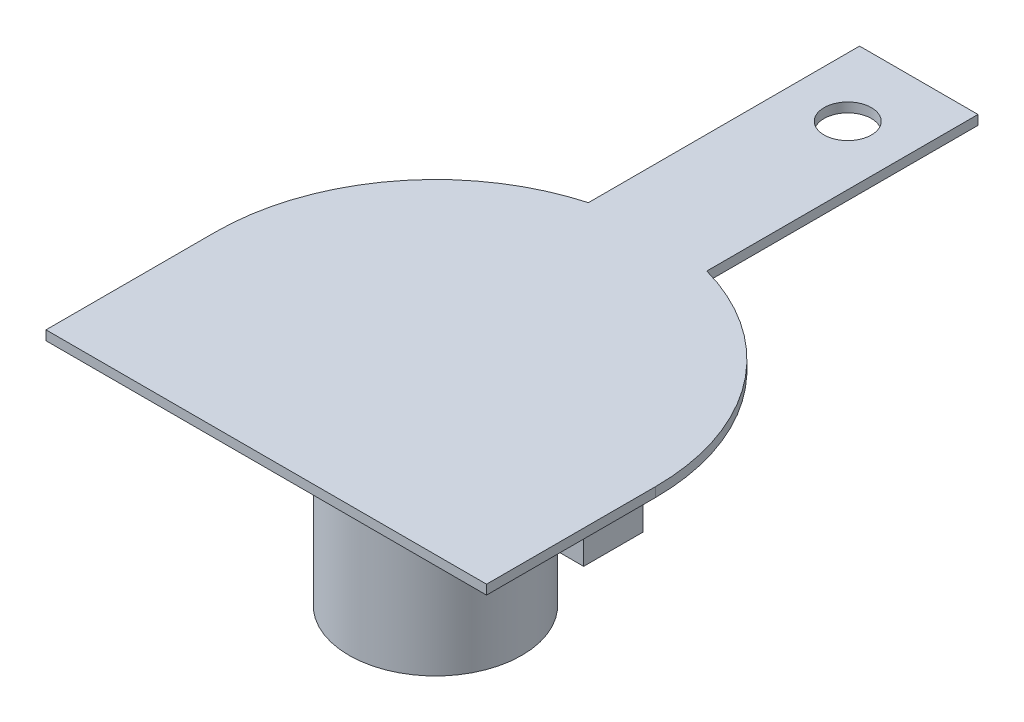
ISO-10303-21;
HEADER;
FILE_DESCRIPTION(('STEP AP214'),'2;1');
FILE_NAME('part.step','',(''),(''),'','','');
FILE_SCHEMA(('AUTOMOTIVE_DESIGN { 1 0 10303 214 1 1 1 1 }'));
ENDSEC;
DATA;
#1=APPLICATION_CONTEXT('core data for automotive mechanical design processes');
#2=APPLICATION_PROTOCOL_DEFINITION('international standard','automotive_design',2000,#1);
#3=PRODUCT_CONTEXT('',#1,'mechanical');
#4=PRODUCT('Part','Part','',(#3));
#5=PRODUCT_RELATED_PRODUCT_CATEGORY('part','',(#4));
#6=PRODUCT_DEFINITION_FORMATION('','',#4);
#7=PRODUCT_DEFINITION_CONTEXT('part definition',#1,'design');
#8=PRODUCT_DEFINITION('design','',#6,#7);
#9=PRODUCT_DEFINITION_SHAPE('','',#8);
#10=(LENGTH_UNIT() NAMED_UNIT(*) SI_UNIT(.MILLI.,.METRE.));
#11=(NAMED_UNIT(*) PLANE_ANGLE_UNIT() SI_UNIT($,.RADIAN.));
#12=(NAMED_UNIT(*) SI_UNIT($,.STERADIAN.) SOLID_ANGLE_UNIT());
#13=UNCERTAINTY_MEASURE_WITH_UNIT(LENGTH_MEASURE(1.E-05),#10,'distance_accuracy_value','');
#14=(GEOMETRIC_REPRESENTATION_CONTEXT(3) GLOBAL_UNCERTAINTY_ASSIGNED_CONTEXT((#13)) GLOBAL_UNIT_ASSIGNED_CONTEXT((#10,
#11,#12)) REPRESENTATION_CONTEXT('',''));
#15=CARTESIAN_POINT('',(0.,0.,0.));
#16=DIRECTION('',(0.,0.,1.));
#17=DIRECTION('',(1.,0.,0.));
#18=AXIS2_PLACEMENT_3D('',#15,#16,#17);
#19=CARTESIAN_POINT('',(0.,0.,-3.57116086468826));
#20=DIRECTION('',(0.,-1.,0.));
#21=DIRECTION('',(0.,0.,-1.));
#22=AXIS2_PLACEMENT_3D('',#19,#20,#21);
#23=PLANE('',#22);
#24=CARTESIAN_POINT('',(0.,0.,-3.57116086468826));
#25=DIRECTION('',(0.,-1.,0.));
#26=DIRECTION('',(0.,0.,-1.));
#27=AXIS2_PLACEMENT_3D('',#24,#25,#26);
#28=CIRCLE('',#27,3.65);
#29=CARTESIAN_POINT('',(0.,0.,-7.22116086468826));
#30=VERTEX_POINT('',#29);
#31=EDGE_CURVE('E337',#30,#30,#28,.F.);
#32=ORIENTED_EDGE('',*,*,#31,.T.);
#33=EDGE_LOOP('',(#32));
#34=FACE_BOUND('',#33,.T.);
#35=CARTESIAN_POINT('',(0.,0.,-20.9788391353117));
#36=DIRECTION('',(0.,-1.,0.));
#37=DIRECTION('',(0.,0.,-1.));
#38=AXIS2_PLACEMENT_3D('',#35,#36,#37);
#39=CIRCLE('',#38,1.);
#40=CARTESIAN_POINT('',(0.,0.,-21.9788391353117));
#41=VERTEX_POINT('',#40);
#42=EDGE_CURVE('E332',#41,#41,#39,.T.);
#43=ORIENTED_EDGE('',*,*,#42,.F.);
#44=EDGE_LOOP('',(#43));
#45=FACE_BOUND('',#44,.T.);
#46=DIRECTION('',(0.,0.,-1.));
#47=VECTOR('',#46,1.);
#48=CARTESIAN_POINT('',(9.3,0.,-3.57116086468826));
#49=LINE('',#48,#47);
#50=CARTESIAN_POINT('',(9.3,0.,3.57116086468826));
#51=VERTEX_POINT('',#50);
#52=CARTESIAN_POINT('',(9.3,0.,-3.57116086468826));
#53=VERTEX_POINT('',#52);
#54=EDGE_CURVE('E203',#51,#53,#49,.T.);
#55=ORIENTED_EDGE('',*,*,#54,.F.);
#56=DIRECTION('',(1.,0.,0.));
#57=VECTOR('',#56,1.);
#58=CARTESIAN_POINT('',(-9.3,0.,3.57116086468826));
#59=LINE('',#58,#57);
#60=CARTESIAN_POINT('',(-9.3,0.,3.57116086468826));
#61=VERTEX_POINT('',#60);
#62=EDGE_CURVE('E208',#61,#51,#59,.T.);
#63=ORIENTED_EDGE('',*,*,#62,.F.);
#64=DIRECTION('',(0.,0.,1.));
#65=VECTOR('',#64,1.);
#66=CARTESIAN_POINT('',(-9.3,0.,-3.57116086468826));
#67=LINE('',#66,#65);
#68=CARTESIAN_POINT('',(-9.3,0.,-3.57116086468826));
#69=VERTEX_POINT('',#68);
#70=EDGE_CURVE('E235',#69,#61,#67,.T.);
#71=ORIENTED_EDGE('',*,*,#70,.F.);
#72=CARTESIAN_POINT('',(0.,0.,-3.57116086468826));
#73=DIRECTION('',(0.,1.,0.));
#74=DIRECTION('',(0.,0.,-1.));
#75=AXIS2_PLACEMENT_3D('',#72,#73,#74);
#76=CIRCLE('',#75,9.3);
#77=CARTESIAN_POINT('',(-2.5,0.,-12.5288391353117));
#78=VERTEX_POINT('',#77);
#79=EDGE_CURVE('E233',#78,#69,#76,.T.);
#80=ORIENTED_EDGE('',*,*,#79,.F.);
#81=DIRECTION('',(0.,0.,1.));
#82=VECTOR('',#81,1.);
#83=CARTESIAN_POINT('',(-2.5,0.,-12.5288391353117));
#84=LINE('',#83,#82);
#85=CARTESIAN_POINT('',(-2.5,0.,-23.9788391353117));
#86=VERTEX_POINT('',#85);
#87=EDGE_CURVE('E231',#86,#78,#84,.T.);
#88=ORIENTED_EDGE('',*,*,#87,.F.);
#89=DIRECTION('',(-1.,0.,0.));
#90=VECTOR('',#89,1.);
#91=CARTESIAN_POINT('',(-2.5,0.,-23.9788391353117));
#92=LINE('',#91,#90);
#93=CARTESIAN_POINT('',(2.5,0.,-23.9788391353117));
#94=VERTEX_POINT('',#93);
#95=EDGE_CURVE('E229',#94,#86,#92,.T.);
#96=ORIENTED_EDGE('',*,*,#95,.F.);
#97=DIRECTION('',(0.,0.,-1.));
#98=VECTOR('',#97,1.);
#99=CARTESIAN_POINT('',(2.5,0.,-23.9788391353117));
#100=LINE('',#99,#98);
#101=CARTESIAN_POINT('',(2.5,0.,-12.5288391353117));
#102=VERTEX_POINT('',#101);
#103=EDGE_CURVE('E227',#102,#94,#100,.T.);
#104=ORIENTED_EDGE('',*,*,#103,.F.);
#105=CARTESIAN_POINT('',(0.,0.,-3.57116086468826));
#106=DIRECTION('',(0.,1.,0.));
#107=DIRECTION('',(0.,0.,-1.));
#108=AXIS2_PLACEMENT_3D('',#105,#106,#107);
#109=CIRCLE('',#108,9.3);
#110=EDGE_CURVE('E225',#53,#102,#109,.T.);
#111=ORIENTED_EDGE('',*,*,#110,.F.);
#112=EDGE_LOOP('',(#55,#63,#71,#80,#88,#96,#104,#111));
#113=FACE_BOUND('',#112,.T.);
#114=DIRECTION('',(1.,0.,0.));
#115=VECTOR('',#114,1.);
#116=CARTESIAN_POINT('',(6.3,0.,-3.52883913531174));
#117=LINE('',#116,#115);
#118=CARTESIAN_POINT('',(6.3,0.,-3.52883913531174));
#119=VERTEX_POINT('',#118);
#120=CARTESIAN_POINT('',(8.8,0.,-3.52883913531174));
#121=VERTEX_POINT('',#120);
#122=EDGE_CURVE('E175',#119,#121,#117,.T.);
#123=ORIENTED_EDGE('',*,*,#122,.F.);
#124=DIRECTION('',(0.,0.,-1.));
#125=VECTOR('',#124,1.);
#126=CARTESIAN_POINT('',(6.3,0.,-1.02883913531174));
#127=LINE('',#126,#125);
#128=CARTESIAN_POINT('',(6.3,0.,-1.02883913531174));
#129=VERTEX_POINT('',#128);
#130=EDGE_CURVE('E172',#129,#119,#127,.T.);
#131=ORIENTED_EDGE('',*,*,#130,.F.);
#132=DIRECTION('',(-1.,0.,0.));
#133=VECTOR('',#132,1.);
#134=CARTESIAN_POINT('',(6.3,0.,-1.02883913531174));
#135=LINE('',#134,#133);
#136=CARTESIAN_POINT('',(8.8,0.,-1.02883913531174));
#137=VERTEX_POINT('',#136);
#138=EDGE_CURVE('E184',#137,#129,#135,.T.);
#139=ORIENTED_EDGE('',*,*,#138,.F.);
#140=DIRECTION('',(0.,0.,1.));
#141=VECTOR('',#140,1.);
#142=CARTESIAN_POINT('',(8.8,0.,-1.02883913531174));
#143=LINE('',#142,#141);
#144=EDGE_CURVE('E192',#121,#137,#143,.T.);
#145=ORIENTED_EDGE('',*,*,#144,.F.);
#146=EDGE_LOOP('',(#123,#131,#139,#145));
#147=FACE_BOUND('',#146,.T.);
#148=DIRECTION('',(0.,0.,-1.));
#149=VECTOR('',#148,1.);
#150=CARTESIAN_POINT('',(-8.8,0.,-1.02883913531174));
#151=LINE('',#150,#149);
#152=CARTESIAN_POINT('',(-8.8,0.,-1.02883913531174));
#153=VERTEX_POINT('',#152);
#154=CARTESIAN_POINT('',(-8.8,0.,-3.52883913531174));
#155=VERTEX_POINT('',#154);
#156=EDGE_CURVE('E334',#153,#155,#151,.T.);
#157=ORIENTED_EDGE('',*,*,#156,.F.);
#158=DIRECTION('',(-1.,0.,0.));
#159=VECTOR('',#158,1.);
#160=CARTESIAN_POINT('',(-6.3,0.,-1.02883913531174));
#161=LINE('',#160,#159);
#162=CARTESIAN_POINT('',(-6.3,0.,-1.02883913531174));
#163=VERTEX_POINT('',#162);
#164=EDGE_CURVE('E170',#163,#153,#161,.T.);
#165=ORIENTED_EDGE('',*,*,#164,.F.);
#166=DIRECTION('',(0.,0.,1.));
#167=VECTOR('',#166,1.);
#168=CARTESIAN_POINT('',(-6.3,0.,-1.02883913531174));
#169=LINE('',#168,#167);
#170=CARTESIAN_POINT('',(-6.3,0.,-3.52883913531174));
#171=VERTEX_POINT('',#170);
#172=EDGE_CURVE('E166',#171,#163,#169,.T.);
#173=ORIENTED_EDGE('',*,*,#172,.F.);
#174=DIRECTION('',(1.,0.,0.));
#175=VECTOR('',#174,1.);
#176=CARTESIAN_POINT('',(-6.3,0.,-3.52883913531174));
#177=LINE('',#176,#175);
#178=EDGE_CURVE('E345',#155,#171,#177,.T.);
#179=ORIENTED_EDGE('',*,*,#178,.F.);
#180=EDGE_LOOP('',(#157,#165,#173,#179));
#181=FACE_BOUND('',#180,.T.);
#182=ADVANCED_FACE('F33',(#34,#45,#113,#147,#181),#23,.T.);
#183=CARTESIAN_POINT('',(9.3,0.4,-3.57116086468826));
#184=DIRECTION('',(-1.,0.,0.));
#185=DIRECTION('',(0.,0.,1.));
#186=AXIS2_PLACEMENT_3D('',#183,#184,#185);
#187=PLANE('',#186);
#188=ORIENTED_EDGE('',*,*,#54,.T.);
#189=DIRECTION('',(0.,-1.,0.));
#190=VECTOR('',#189,1.);
#191=CARTESIAN_POINT('',(9.3,0.4,-3.57116086468826));
#192=LINE('',#191,#190);
#193=CARTESIAN_POINT('',(9.3,0.4,-3.57116086468826));
#194=VERTEX_POINT('',#193);
#195=EDGE_CURVE('E11',#194,#53,#192,.T.);
#196=ORIENTED_EDGE('',*,*,#195,.F.);
#197=DIRECTION('',(0.,0.,-1.));
#198=VECTOR('',#197,1.);
#199=CARTESIAN_POINT('',(9.3,0.4,-3.57116086468826));
#200=LINE('',#199,#198);
#201=CARTESIAN_POINT('',(9.3,0.4,3.57116086468826));
#202=VERTEX_POINT('',#201);
#203=EDGE_CURVE('E204',#202,#194,#200,.T.);
#204=ORIENTED_EDGE('',*,*,#203,.F.);
#205=DIRECTION('',(0.,-1.,0.));
#206=VECTOR('',#205,1.);
#207=CARTESIAN_POINT('',(9.3,0.4,3.57116086468826));
#208=LINE('',#207,#206);
#209=EDGE_CURVE('E222',#202,#51,#208,.T.);
#210=ORIENTED_EDGE('',*,*,#209,.T.);
#211=EDGE_LOOP('',(#188,#196,#204,#210));
#212=FACE_BOUND('',#211,.T.);
#213=ADVANCED_FACE('F35',(#212),#187,.F.);
#214=CARTESIAN_POINT('',(0.,0.4,-3.57116086468826));
#215=DIRECTION('',(0.,-1.,0.));
#216=DIRECTION('',(0.,0.,-1.));
#217=AXIS2_PLACEMENT_3D('',#214,#215,#216);
#218=CYLINDRICAL_SURFACE('',#217,9.3);
#219=ORIENTED_EDGE('',*,*,#110,.T.);
#220=DIRECTION('',(0.,-1.,0.));
#221=VECTOR('',#220,1.);
#222=CARTESIAN_POINT('',(2.5,0.4,-12.5288391353117));
#223=LINE('',#222,#221);
#224=CARTESIAN_POINT('',(2.5,0.4,-12.5288391353117));
#225=VERTEX_POINT('',#224);
#226=EDGE_CURVE('E41',#225,#102,#223,.T.);
#227=ORIENTED_EDGE('',*,*,#226,.F.);
#228=CARTESIAN_POINT('',(0.,0.4,-3.57116086468826));
#229=DIRECTION('',(0.,1.,0.));
#230=DIRECTION('',(0.,0.,-1.));
#231=AXIS2_PLACEMENT_3D('',#228,#229,#230);
#232=CIRCLE('',#231,9.3);
#233=EDGE_CURVE('E207',#194,#225,#232,.T.);
#234=ORIENTED_EDGE('',*,*,#233,.F.);
#235=ORIENTED_EDGE('',*,*,#195,.T.);
#236=EDGE_LOOP('',(#219,#227,#234,#235));
#237=FACE_BOUND('',#236,.T.);
#238=ADVANCED_FACE('F282',(#237),#218,.T.);
#239=CARTESIAN_POINT('',(2.5,0.4,-23.9788391353117));
#240=DIRECTION('',(-1.,0.,0.));
#241=DIRECTION('',(0.,0.,1.));
#242=AXIS2_PLACEMENT_3D('',#239,#240,#241);
#243=PLANE('',#242);
#244=ORIENTED_EDGE('',*,*,#103,.T.);
#245=DIRECTION('',(0.,-1.,0.));
#246=VECTOR('',#245,1.);
#247=CARTESIAN_POINT('',(2.5,0.4,-23.9788391353117));
#248=LINE('',#247,#246);
#249=CARTESIAN_POINT('',(2.5,0.4,-23.9788391353117));
#250=VERTEX_POINT('',#249);
#251=EDGE_CURVE('E252',#250,#94,#248,.T.);
#252=ORIENTED_EDGE('',*,*,#251,.F.);
#253=DIRECTION('',(0.,0.,-1.));
#254=VECTOR('',#253,1.);
#255=CARTESIAN_POINT('',(2.5,0.4,-23.9788391353117));
#256=LINE('',#255,#254);
#257=EDGE_CURVE('E210',#225,#250,#256,.T.);
#258=ORIENTED_EDGE('',*,*,#257,.F.);
#259=ORIENTED_EDGE('',*,*,#226,.T.);
#260=EDGE_LOOP('',(#244,#252,#258,#259));
#261=FACE_BOUND('',#260,.T.);
#262=ADVANCED_FACE('F259',(#261),#243,.F.);
#263=CARTESIAN_POINT('',(-2.5,0.4,-23.9788391353117));
#264=DIRECTION('',(0.,0.,1.));
#265=DIRECTION('',(1.,0.,0.));
#266=AXIS2_PLACEMENT_3D('',#263,#264,#265);
#267=PLANE('',#266);
#268=ORIENTED_EDGE('',*,*,#95,.T.);
#269=DIRECTION('',(0.,-1.,0.));
#270=VECTOR('',#269,1.);
#271=CARTESIAN_POINT('',(-2.5,0.4,-23.9788391353117));
#272=LINE('',#271,#270);
#273=CARTESIAN_POINT('',(-2.5,0.4,-23.9788391353117));
#274=VERTEX_POINT('',#273);
#275=EDGE_CURVE('E249',#274,#86,#272,.T.);
#276=ORIENTED_EDGE('',*,*,#275,.F.);
#277=DIRECTION('',(-1.,0.,0.));
#278=VECTOR('',#277,1.);
#279=CARTESIAN_POINT('',(-2.5,0.4,-23.9788391353117));
#280=LINE('',#279,#278);
#281=EDGE_CURVE('E212',#250,#274,#280,.T.);
#282=ORIENTED_EDGE('',*,*,#281,.F.);
#283=ORIENTED_EDGE('',*,*,#251,.T.);
#284=EDGE_LOOP('',(#268,#276,#282,#283));
#285=FACE_BOUND('',#284,.T.);
#286=ADVANCED_FACE('F270',(#285),#267,.F.);
#287=CARTESIAN_POINT('',(-2.5,0.4,-12.5288391353117));
#288=DIRECTION('',(1.,0.,0.));
#289=DIRECTION('',(0.,0.,-1.));
#290=AXIS2_PLACEMENT_3D('',#287,#288,#289);
#291=PLANE('',#290);
#292=ORIENTED_EDGE('',*,*,#87,.T.);
#293=DIRECTION('',(0.,-1.,0.));
#294=VECTOR('',#293,1.);
#295=CARTESIAN_POINT('',(-2.5,0.4,-12.5288391353117));
#296=LINE('',#295,#294);
#297=CARTESIAN_POINT('',(-2.5,0.4,-12.5288391353117));
#298=VERTEX_POINT('',#297);
#299=EDGE_CURVE('E246',#298,#78,#296,.T.);
#300=ORIENTED_EDGE('',*,*,#299,.F.);
#301=DIRECTION('',(0.,0.,1.));
#302=VECTOR('',#301,1.);
#303=CARTESIAN_POINT('',(-2.5,0.4,-12.5288391353117));
#304=LINE('',#303,#302);
#305=EDGE_CURVE('E214',#274,#298,#304,.T.);
#306=ORIENTED_EDGE('',*,*,#305,.F.);
#307=ORIENTED_EDGE('',*,*,#275,.T.);
#308=EDGE_LOOP('',(#292,#300,#306,#307));
#309=FACE_BOUND('',#308,.T.);
#310=ADVANCED_FACE('F274',(#309),#291,.F.);
#311=CARTESIAN_POINT('',(0.,0.4,-3.57116086468826));
#312=DIRECTION('',(0.,-1.,0.));
#313=DIRECTION('',(0.,0.,-1.));
#314=AXIS2_PLACEMENT_3D('',#311,#312,#313);
#315=CYLINDRICAL_SURFACE('',#314,9.3);
#316=ORIENTED_EDGE('',*,*,#79,.T.);
#317=DIRECTION('',(0.,-1.,0.));
#318=VECTOR('',#317,1.);
#319=CARTESIAN_POINT('',(-9.3,0.4,-3.57116086468826));
#320=LINE('',#319,#318);
#321=CARTESIAN_POINT('',(-9.3,0.4,-3.57116086468826));
#322=VERTEX_POINT('',#321);
#323=EDGE_CURVE('E243',#322,#69,#320,.T.);
#324=ORIENTED_EDGE('',*,*,#323,.F.);
#325=CARTESIAN_POINT('',(0.,0.4,-3.57116086468826));
#326=DIRECTION('',(0.,1.,0.));
#327=DIRECTION('',(0.,0.,-1.));
#328=AXIS2_PLACEMENT_3D('',#325,#326,#327);
#329=CIRCLE('',#328,9.3);
#330=EDGE_CURVE('E216',#298,#322,#329,.T.);
#331=ORIENTED_EDGE('',*,*,#330,.F.);
#332=ORIENTED_EDGE('',*,*,#299,.T.);
#333=EDGE_LOOP('',(#316,#324,#331,#332));
#334=FACE_BOUND('',#333,.T.);
#335=ADVANCED_FACE('F295',(#334),#315,.T.);
#336=CARTESIAN_POINT('',(-9.3,0.4,-3.57116086468826));
#337=DIRECTION('',(1.,0.,0.));
#338=DIRECTION('',(0.,0.,-1.));
#339=AXIS2_PLACEMENT_3D('',#336,#337,#338);
#340=PLANE('',#339);
#341=ORIENTED_EDGE('',*,*,#70,.T.);
#342=DIRECTION('',(0.,-1.,0.));
#343=VECTOR('',#342,1.);
#344=CARTESIAN_POINT('',(-9.3,0.4,3.57116086468826));
#345=LINE('',#344,#343);
#346=CARTESIAN_POINT('',(-9.3,0.4,3.57116086468826));
#347=VERTEX_POINT('',#346);
#348=EDGE_CURVE('E240',#347,#61,#345,.T.);
#349=ORIENTED_EDGE('',*,*,#348,.F.);
#350=DIRECTION('',(0.,0.,1.));
#351=VECTOR('',#350,1.);
#352=CARTESIAN_POINT('',(-9.3,0.4,-3.57116086468826));
#353=LINE('',#352,#351);
#354=EDGE_CURVE('E218',#322,#347,#353,.T.);
#355=ORIENTED_EDGE('',*,*,#354,.F.);
#356=ORIENTED_EDGE('',*,*,#323,.T.);
#357=EDGE_LOOP('',(#341,#349,#355,#356));
#358=FACE_BOUND('',#357,.T.);
#359=ADVANCED_FACE('F293',(#358),#340,.F.);
#360=CARTESIAN_POINT('',(-9.3,0.4,3.57116086468826));
#361=DIRECTION('',(0.,0.,-1.));
#362=DIRECTION('',(-1.,0.,0.));
#363=AXIS2_PLACEMENT_3D('',#360,#361,#362);
#364=PLANE('',#363);
#365=ORIENTED_EDGE('',*,*,#62,.T.);
#366=ORIENTED_EDGE('',*,*,#209,.F.);
#367=DIRECTION('',(1.,0.,0.));
#368=VECTOR('',#367,1.);
#369=CARTESIAN_POINT('',(-9.3,0.4,3.57116086468826));
#370=LINE('',#369,#368);
#371=EDGE_CURVE('E220',#347,#202,#370,.T.);
#372=ORIENTED_EDGE('',*,*,#371,.F.);
#373=ORIENTED_EDGE('',*,*,#348,.T.);
#374=EDGE_LOOP('',(#365,#366,#372,#373));
#375=FACE_BOUND('',#374,.T.);
#376=ADVANCED_FACE('F288',(#375),#364,.F.);
#377=CARTESIAN_POINT('',(0.,0.4,-3.57116086468826));
#378=DIRECTION('',(0.,-1.,0.));
#379=DIRECTION('',(0.,0.,-1.));
#380=AXIS2_PLACEMENT_3D('',#377,#378,#379);
#381=PLANE('',#380);
#382=CARTESIAN_POINT('',(0.,0.4,-20.9788391353117));
#383=DIRECTION('',(0.,-1.,0.));
#384=DIRECTION('',(0.,0.,-1.));
#385=AXIS2_PLACEMENT_3D('',#382,#383,#384);
#386=CIRCLE('',#385,1.);
#387=CARTESIAN_POINT('',(0.,0.4,-21.9788391353117));
#388=VERTEX_POINT('',#387);
#389=EDGE_CURVE('E330',#388,#388,#386,.F.);
#390=ORIENTED_EDGE('',*,*,#389,.F.);
#391=EDGE_LOOP('',(#390));
#392=FACE_BOUND('',#391,.T.);
#393=ORIENTED_EDGE('',*,*,#203,.T.);
#394=ORIENTED_EDGE('',*,*,#233,.T.);
#395=ORIENTED_EDGE('',*,*,#257,.T.);
#396=ORIENTED_EDGE('',*,*,#281,.T.);
#397=ORIENTED_EDGE('',*,*,#305,.T.);
#398=ORIENTED_EDGE('',*,*,#330,.T.);
#399=ORIENTED_EDGE('',*,*,#354,.T.);
#400=ORIENTED_EDGE('',*,*,#371,.T.);
#401=EDGE_LOOP('',(#393,#394,#395,#396,#397,#398,#399,#400));
#402=FACE_BOUND('',#401,.T.);
#403=ADVANCED_FACE('F278',(#392,#402),#381,.F.);
#404=CARTESIAN_POINT('',(6.3,-1.5,-1.02883913531174));
#405=DIRECTION('',(1.,0.,0.));
#406=DIRECTION('',(0.,0.,-1.));
#407=AXIS2_PLACEMENT_3D('',#404,#405,#406);
#408=PLANE('',#407);
#409=ORIENTED_EDGE('',*,*,#130,.T.);
#410=DIRECTION('',(0.,1.,0.));
#411=VECTOR('',#410,1.);
#412=CARTESIAN_POINT('',(6.3,-1.5,-3.52883913531174));
#413=LINE('',#412,#411);
#414=CARTESIAN_POINT('',(6.3,-1.5,-3.52883913531174));
#415=VERTEX_POINT('',#414);
#416=EDGE_CURVE('E201',#415,#119,#413,.T.);
#417=ORIENTED_EDGE('',*,*,#416,.F.);
#418=DIRECTION('',(0.,0.,-1.));
#419=VECTOR('',#418,1.);
#420=CARTESIAN_POINT('',(6.3,-1.5,-1.02883913531174));
#421=LINE('',#420,#419);
#422=CARTESIAN_POINT('',(6.3,-1.5,-1.02883913531174));
#423=VERTEX_POINT('',#422);
#424=EDGE_CURVE('E180',#423,#415,#421,.T.);
#425=ORIENTED_EDGE('',*,*,#424,.F.);
#426=DIRECTION('',(0.,1.,0.));
#427=VECTOR('',#426,1.);
#428=CARTESIAN_POINT('',(6.3,-1.5,-1.02883913531174));
#429=LINE('',#428,#427);
#430=EDGE_CURVE('E189',#423,#129,#429,.T.);
#431=ORIENTED_EDGE('',*,*,#430,.T.);
#432=EDGE_LOOP('',(#409,#417,#425,#431));
#433=FACE_BOUND('',#432,.T.);
#434=ADVANCED_FACE('F321',(#433),#408,.F.);
#435=CARTESIAN_POINT('',(6.3,-1.5,-3.52883913531174));
#436=DIRECTION('',(0.,0.,1.));
#437=DIRECTION('',(1.,0.,0.));
#438=AXIS2_PLACEMENT_3D('',#435,#436,#437);
#439=PLANE('',#438);
#440=ORIENTED_EDGE('',*,*,#122,.T.);
#441=DIRECTION('',(0.,1.,0.));
#442=VECTOR('',#441,1.);
#443=CARTESIAN_POINT('',(8.8,-1.5,-3.52883913531174));
#444=LINE('',#443,#442);
#445=CARTESIAN_POINT('',(8.8,-1.5,-3.52883913531174));
#446=VERTEX_POINT('',#445);
#447=EDGE_CURVE('E198',#446,#121,#444,.T.);
#448=ORIENTED_EDGE('',*,*,#447,.F.);
#449=DIRECTION('',(1.,0.,0.));
#450=VECTOR('',#449,1.);
#451=CARTESIAN_POINT('',(6.3,-1.5,-3.52883913531174));
#452=LINE('',#451,#450);
#453=EDGE_CURVE('E183',#415,#446,#452,.T.);
#454=ORIENTED_EDGE('',*,*,#453,.F.);
#455=ORIENTED_EDGE('',*,*,#416,.T.);
#456=EDGE_LOOP('',(#440,#448,#454,#455));
#457=FACE_BOUND('',#456,.T.);
#458=ADVANCED_FACE('F326',(#457),#439,.F.);
#459=CARTESIAN_POINT('',(8.8,-1.5,-1.02883913531174));
#460=DIRECTION('',(-1.,0.,0.));
#461=DIRECTION('',(0.,0.,1.));
#462=AXIS2_PLACEMENT_3D('',#459,#460,#461);
#463=PLANE('',#462);
#464=ORIENTED_EDGE('',*,*,#144,.T.);
#465=DIRECTION('',(0.,1.,0.));
#466=VECTOR('',#465,1.);
#467=CARTESIAN_POINT('',(8.8,-1.5,-1.02883913531174));
#468=LINE('',#467,#466);
#469=CARTESIAN_POINT('',(8.8,-1.5,-1.02883913531174));
#470=VERTEX_POINT('',#469);
#471=EDGE_CURVE('E56',#470,#137,#468,.T.);
#472=ORIENTED_EDGE('',*,*,#471,.F.);
#473=DIRECTION('',(0.,0.,1.));
#474=VECTOR('',#473,1.);
#475=CARTESIAN_POINT('',(8.8,-1.5,-1.02883913531174));
#476=LINE('',#475,#474);
#477=EDGE_CURVE('E186',#446,#470,#476,.T.);
#478=ORIENTED_EDGE('',*,*,#477,.F.);
#479=ORIENTED_EDGE('',*,*,#447,.T.);
#480=EDGE_LOOP('',(#464,#472,#478,#479));
#481=FACE_BOUND('',#480,.T.);
#482=ADVANCED_FACE('F376',(#481),#463,.F.);
#483=CARTESIAN_POINT('',(6.3,-1.5,-1.02883913531174));
#484=DIRECTION('',(0.,0.,-1.));
#485=DIRECTION('',(-1.,0.,0.));
#486=AXIS2_PLACEMENT_3D('',#483,#484,#485);
#487=PLANE('',#486);
#488=ORIENTED_EDGE('',*,*,#138,.T.);
#489=ORIENTED_EDGE('',*,*,#430,.F.);
#490=DIRECTION('',(-1.,0.,0.));
#491=VECTOR('',#490,1.);
#492=CARTESIAN_POINT('',(6.3,-1.5,-1.02883913531174));
#493=LINE('',#492,#491);
#494=EDGE_CURVE('E188',#470,#423,#493,.T.);
#495=ORIENTED_EDGE('',*,*,#494,.F.);
#496=ORIENTED_EDGE('',*,*,#471,.T.);
#497=EDGE_LOOP('',(#488,#489,#495,#496));
#498=FACE_BOUND('',#497,.T.);
#499=ADVANCED_FACE('F372',(#498),#487,.F.);
#500=CARTESIAN_POINT('',(0.,-1.5,0.));
#501=DIRECTION('',(0.,-1.,0.));
#502=DIRECTION('',(0.,0.,-1.));
#503=AXIS2_PLACEMENT_3D('',#500,#501,#502);
#504=PLANE('',#503);
#505=ORIENTED_EDGE('',*,*,#424,.T.);
#506=ORIENTED_EDGE('',*,*,#453,.T.);
#507=ORIENTED_EDGE('',*,*,#477,.T.);
#508=ORIENTED_EDGE('',*,*,#494,.T.);
#509=EDGE_LOOP('',(#505,#506,#507,#508));
#510=FACE_BOUND('',#509,.T.);
#511=ADVANCED_FACE('F369',(#510),#504,.T.);
#512=CARTESIAN_POINT('',(-6.3,-1.5,-1.02883913531174));
#513=DIRECTION('',(0.,0.,-1.));
#514=DIRECTION('',(-1.,0.,0.));
#515=AXIS2_PLACEMENT_3D('',#512,#513,#514);
#516=PLANE('',#515);
#517=ORIENTED_EDGE('',*,*,#164,.T.);
#518=DIRECTION('',(0.,1.,0.));
#519=VECTOR('',#518,1.);
#520=CARTESIAN_POINT('',(-8.8,-1.5,-1.02883913531174));
#521=LINE('',#520,#519);
#522=CARTESIAN_POINT('',(-8.8,-1.5,-1.02883913531174));
#523=VERTEX_POINT('',#522);
#524=EDGE_CURVE('E151',#523,#153,#521,.T.);
#525=ORIENTED_EDGE('',*,*,#524,.F.);
#526=DIRECTION('',(-1.,0.,0.));
#527=VECTOR('',#526,1.);
#528=CARTESIAN_POINT('',(-6.3,-1.5,-1.02883913531174));
#529=LINE('',#528,#527);
#530=CARTESIAN_POINT('',(-6.3,-1.5,-1.02883913531174));
#531=VERTEX_POINT('',#530);
#532=EDGE_CURVE('E158',#531,#523,#529,.T.);
#533=ORIENTED_EDGE('',*,*,#532,.F.);
#534=DIRECTION('',(0.,1.,0.));
#535=VECTOR('',#534,1.);
#536=CARTESIAN_POINT('',(-6.3,-1.5,-1.02883913531174));
#537=LINE('',#536,#535);
#538=EDGE_CURVE('E342',#531,#163,#537,.T.);
#539=ORIENTED_EDGE('',*,*,#538,.T.);
#540=EDGE_LOOP('',(#517,#525,#533,#539));
#541=FACE_BOUND('',#540,.T.);
#542=ADVANCED_FACE('F168',(#541),#516,.F.);
#543=CARTESIAN_POINT('',(-8.8,-1.5,-1.02883913531174));
#544=DIRECTION('',(1.,0.,0.));
#545=DIRECTION('',(0.,0.,-1.));
#546=AXIS2_PLACEMENT_3D('',#543,#544,#545);
#547=PLANE('',#546);
#548=ORIENTED_EDGE('',*,*,#156,.T.);
#549=DIRECTION('',(0.,1.,0.));
#550=VECTOR('',#549,1.);
#551=CARTESIAN_POINT('',(-8.8,-1.5,-3.52883913531174));
#552=LINE('',#551,#550);
#553=CARTESIAN_POINT('',(-8.8,-1.5,-3.52883913531174));
#554=VERTEX_POINT('',#553);
#555=EDGE_CURVE('E154',#554,#155,#552,.T.);
#556=ORIENTED_EDGE('',*,*,#555,.F.);
#557=DIRECTION('',(0.,0.,-1.));
#558=VECTOR('',#557,1.);
#559=CARTESIAN_POINT('',(-8.8,-1.5,-1.02883913531174));
#560=LINE('',#559,#558);
#561=EDGE_CURVE('E147',#523,#554,#560,.T.);
#562=ORIENTED_EDGE('',*,*,#561,.F.);
#563=ORIENTED_EDGE('',*,*,#524,.T.);
#564=EDGE_LOOP('',(#548,#556,#562,#563));
#565=FACE_BOUND('',#564,.T.);
#566=ADVANCED_FACE('F149',(#565),#547,.F.);
#567=CARTESIAN_POINT('',(-6.3,-1.5,-3.52883913531174));
#568=DIRECTION('',(0.,0.,1.));
#569=DIRECTION('',(1.,0.,0.));
#570=AXIS2_PLACEMENT_3D('',#567,#568,#569);
#571=PLANE('',#570);
#572=ORIENTED_EDGE('',*,*,#178,.T.);
#573=DIRECTION('',(0.,1.,0.));
#574=VECTOR('',#573,1.);
#575=CARTESIAN_POINT('',(-6.3,-1.5,-3.52883913531174));
#576=LINE('',#575,#574);
#577=CARTESIAN_POINT('',(-6.3,-1.5,-3.52883913531174));
#578=VERTEX_POINT('',#577);
#579=EDGE_CURVE('E48',#578,#171,#576,.T.);
#580=ORIENTED_EDGE('',*,*,#579,.F.);
#581=DIRECTION('',(1.,0.,0.));
#582=VECTOR('',#581,1.);
#583=CARTESIAN_POINT('',(-6.3,-1.5,-3.52883913531174));
#584=LINE('',#583,#582);
#585=EDGE_CURVE('E157',#554,#578,#584,.T.);
#586=ORIENTED_EDGE('',*,*,#585,.F.);
#587=ORIENTED_EDGE('',*,*,#555,.T.);
#588=EDGE_LOOP('',(#572,#580,#586,#587));
#589=FACE_BOUND('',#588,.T.);
#590=ADVANCED_FACE('F352',(#589),#571,.F.);
#591=CARTESIAN_POINT('',(-6.3,-1.5,-1.02883913531174));
#592=DIRECTION('',(-1.,0.,0.));
#593=DIRECTION('',(0.,0.,1.));
#594=AXIS2_PLACEMENT_3D('',#591,#592,#593);
#595=PLANE('',#594);
#596=ORIENTED_EDGE('',*,*,#172,.T.);
#597=ORIENTED_EDGE('',*,*,#538,.F.);
#598=DIRECTION('',(0.,0.,1.));
#599=VECTOR('',#598,1.);
#600=CARTESIAN_POINT('',(-6.3,-1.5,-1.02883913531174));
#601=LINE('',#600,#599);
#602=EDGE_CURVE('E162',#578,#531,#601,.T.);
#603=ORIENTED_EDGE('',*,*,#602,.F.);
#604=ORIENTED_EDGE('',*,*,#579,.T.);
#605=EDGE_LOOP('',(#596,#597,#603,#604));
#606=FACE_BOUND('',#605,.T.);
#607=ADVANCED_FACE('F353',(#606),#595,.F.);
#608=CARTESIAN_POINT('',(0.,-1.5,0.));
#609=DIRECTION('',(0.,-1.,0.));
#610=DIRECTION('',(0.,0.,-1.));
#611=AXIS2_PLACEMENT_3D('',#608,#609,#610);
#612=PLANE('',#611);
#613=ORIENTED_EDGE('',*,*,#532,.T.);
#614=ORIENTED_EDGE('',*,*,#561,.T.);
#615=ORIENTED_EDGE('',*,*,#585,.T.);
#616=ORIENTED_EDGE('',*,*,#602,.T.);
#617=EDGE_LOOP('',(#613,#614,#615,#616));
#618=FACE_BOUND('',#617,.T.);
#619=ADVANCED_FACE('F161',(#618),#612,.T.);
#620=CARTESIAN_POINT('',(0.,0.401,-20.9788391353117));
#621=DIRECTION('',(0.,-1.,0.));
#622=DIRECTION('',(0.,0.,-1.));
#623=AXIS2_PLACEMENT_3D('',#620,#621,#622);
#624=CYLINDRICAL_SURFACE('',#623,1.);
#625=CARTESIAN_POINT('',(0.,0.,-21.9788391353117));
#626=CARTESIAN_POINT('',(0.,0.00416666666666666,-21.9788391353117));
#627=CARTESIAN_POINT('',(0.,0.00833333333333332,-21.9788391353117));
#628=CARTESIAN_POINT('',(0.,0.0166666666666667,-21.9788391353117));
#629=CARTESIAN_POINT('',(0.,0.0208333333333333,-21.9788391353117));
#630=CARTESIAN_POINT('',(0.,0.0291666666666667,-21.9788391353117));
#631=CARTESIAN_POINT('',(0.,0.0333333333333333,-21.9788391353117));
#632=CARTESIAN_POINT('',(0.,0.0416666666666667,-21.9788391353117));
#633=CARTESIAN_POINT('',(0.,0.0458333333333333,-21.9788391353117));
#634=CARTESIAN_POINT('',(0.,0.0541666666666667,-21.9788391353117));
#635=CARTESIAN_POINT('',(0.,0.0583333333333333,-21.9788391353117));
#636=CARTESIAN_POINT('',(0.,0.0666666666666667,-21.9788391353117));
#637=CARTESIAN_POINT('',(0.,0.0708333333333333,-21.9788391353117));
#638=CARTESIAN_POINT('',(0.,0.0791666666666667,-21.9788391353117));
#639=CARTESIAN_POINT('',(0.,0.0833333333333333,-21.9788391353117));
#640=CARTESIAN_POINT('',(0.,0.0916666666666667,-21.9788391353117));
#641=CARTESIAN_POINT('',(0.,0.0958333333333334,-21.9788391353117));
#642=CARTESIAN_POINT('',(0.,0.104166666666667,-21.9788391353117));
#643=CARTESIAN_POINT('',(0.,0.108333333333333,-21.9788391353117));
#644=CARTESIAN_POINT('',(0.,0.116666666666667,-21.9788391353117));
#645=CARTESIAN_POINT('',(0.,0.120833333333333,-21.9788391353117));
#646=CARTESIAN_POINT('',(0.,0.129166666666667,-21.9788391353117));
#647=CARTESIAN_POINT('',(0.,0.133333333333333,-21.9788391353117));
#648=CARTESIAN_POINT('',(0.,0.141666666666667,-21.9788391353117));
#649=CARTESIAN_POINT('',(0.,0.145833333333333,-21.9788391353117));
#650=CARTESIAN_POINT('',(0.,0.154166666666667,-21.9788391353117));
#651=CARTESIAN_POINT('',(0.,0.158333333333333,-21.9788391353117));
#652=CARTESIAN_POINT('',(0.,0.166666666666667,-21.9788391353117));
#653=CARTESIAN_POINT('',(0.,0.170833333333333,-21.9788391353117));
#654=CARTESIAN_POINT('',(0.,0.179166666666667,-21.9788391353117));
#655=CARTESIAN_POINT('',(0.,0.183333333333333,-21.9788391353117));
#656=CARTESIAN_POINT('',(0.,0.191666666666667,-21.9788391353117));
#657=CARTESIAN_POINT('',(0.,0.195833333333333,-21.9788391353117));
#658=CARTESIAN_POINT('',(0.,0.204166666666667,-21.9788391353117));
#659=CARTESIAN_POINT('',(0.,0.208333333333333,-21.9788391353117));
#660=CARTESIAN_POINT('',(0.,0.216666666666667,-21.9788391353117));
#661=CARTESIAN_POINT('',(0.,0.220833333333333,-21.9788391353117));
#662=CARTESIAN_POINT('',(0.,0.229166666666667,-21.9788391353117));
#663=CARTESIAN_POINT('',(0.,0.233333333333333,-21.9788391353117));
#664=CARTESIAN_POINT('',(0.,0.241666666666667,-21.9788391353117));
#665=CARTESIAN_POINT('',(0.,0.245833333333333,-21.9788391353117));
#666=CARTESIAN_POINT('',(0.,0.254166666666667,-21.9788391353117));
#667=CARTESIAN_POINT('',(0.,0.258333333333333,-21.9788391353117));
#668=CARTESIAN_POINT('',(0.,0.266666666666667,-21.9788391353117));
#669=CARTESIAN_POINT('',(0.,0.270833333333333,-21.9788391353117));
#670=CARTESIAN_POINT('',(0.,0.279166666666667,-21.9788391353117));
#671=CARTESIAN_POINT('',(0.,0.283333333333333,-21.9788391353117));
#672=CARTESIAN_POINT('',(0.,0.291666666666667,-21.9788391353117));
#673=CARTESIAN_POINT('',(0.,0.295833333333333,-21.9788391353117));
#674=CARTESIAN_POINT('',(0.,0.304166666666667,-21.9788391353117));
#675=CARTESIAN_POINT('',(0.,0.308333333333333,-21.9788391353117));
#676=CARTESIAN_POINT('',(0.,0.316666666666667,-21.9788391353117));
#677=CARTESIAN_POINT('',(0.,0.320833333333333,-21.9788391353117));
#678=CARTESIAN_POINT('',(0.,0.329166666666667,-21.9788391353117));
#679=CARTESIAN_POINT('',(0.,0.333333333333333,-21.9788391353117));
#680=CARTESIAN_POINT('',(0.,0.341666666666667,-21.9788391353117));
#681=CARTESIAN_POINT('',(0.,0.345833333333333,-21.9788391353117));
#682=CARTESIAN_POINT('',(0.,0.354166666666667,-21.9788391353117));
#683=CARTESIAN_POINT('',(0.,0.358333333333333,-21.9788391353117));
#684=CARTESIAN_POINT('',(0.,0.366666666666667,-21.9788391353117));
#685=CARTESIAN_POINT('',(0.,0.370833333333333,-21.9788391353117));
#686=CARTESIAN_POINT('',(0.,0.379166666666667,-21.9788391353117));
#687=CARTESIAN_POINT('',(0.,0.383333333333333,-21.9788391353117));
#688=CARTESIAN_POINT('',(0.,0.391666666666667,-21.9788391353117));
#689=CARTESIAN_POINT('',(0.,0.395833333333333,-21.9788391353117));
#690=CARTESIAN_POINT('',(0.,0.4,-21.9788391353117));
#691=B_SPLINE_CURVE_WITH_KNOTS('',3,(#625,#626,#627,#628,#629,#630,#631,#632,#633,#634,#635,
#636,#637,#638,#639,#640,#641,#642,#643,#644,#645,#646,#647,#648,#649,#650,#651,#652,#653,#654,
#655,#656,#657,#658,#659,#660,#661,#662,#663,#664,#665,#666,#667,#668,#669,#670,#671,#672,#673,
#674,#675,#676,#677,#678,#679,#680,#681,#682,#683,#684,#685,#686,#687,#688,#689,#690),
.UNSPECIFIED.,.F.,.F.,(4,2,2,2,2,2,2,2,2,2,2,2,2,2,2,2,2,2,2,2,2,2,2,2,2,2,2,2,2,2,2,2,4),(0.,
0.0125,0.025,0.0375,0.05,0.0625,0.075,0.0875,0.1,0.1125,0.125,0.1375,0.15,0.1625,0.175,0.1875,
0.2,0.2125,0.225,0.2375,0.25,0.2625,0.275,0.2875,0.3,0.3125,0.325,0.3375,0.35,0.3625,0.375,
0.3875,0.4),.UNSPECIFIED.);
#692=EDGE_CURVE('BSEAM360',#41,#388,#691,.T.);
#693=ORIENTED_EDGE('',*,*,#42,.T.);
#694=ORIENTED_EDGE('',*,*,#389,.T.);
#695=ORIENTED_EDGE('',*,*,#692,.T.);
#696=ORIENTED_EDGE('',*,*,#692,.F.);
#697=EDGE_LOOP('',(#693,#695,#694,#696));
#698=FACE_BOUND('',#697,.T.);
#699=ADVANCED_FACE('F360',(#698),#624,.F.);
#700=CARTESIAN_POINT('',(0.,-8.6,-3.57116086468826));
#701=DIRECTION('',(0.,1.,0.));
#702=DIRECTION('',(0.,0.,1.));
#703=AXIS2_PLACEMENT_3D('',#700,#701,#702);
#704=CYLINDRICAL_SURFACE('',#703,3.65);
#705=ORIENTED_EDGE('',*,*,#31,.F.);
#706=EDGE_LOOP('',(#705));
#707=FACE_BOUND('',#706,.T.);
#708=CARTESIAN_POINT('',(0.,-8.6,-3.57116086468826));
#709=DIRECTION('',(0.,-1.,0.));
#710=DIRECTION('',(0.,0.,-1.));
#711=AXIS2_PLACEMENT_3D('',#708,#709,#710);
#712=CIRCLE('',#711,3.65);
#713=CARTESIAN_POINT('',(0.,-8.6,-7.22116086468826));
#714=VERTEX_POINT('',#713);
#715=EDGE_CURVE('E461',#714,#714,#712,.T.);
#716=ORIENTED_EDGE('',*,*,#715,.F.);
#717=EDGE_LOOP('',(#716));
#718=FACE_BOUND('',#717,.T.);
#719=ADVANCED_FACE('F436',(#707,#718),#704,.T.);
#720=CARTESIAN_POINT('',(0.,-8.6,-3.57116086468826));
#721=DIRECTION('',(0.,-1.,0.));
#722=DIRECTION('',(0.,0.,-1.));
#723=AXIS2_PLACEMENT_3D('',#720,#721,#722);
#724=PLANE('',#723);
#725=ORIENTED_EDGE('',*,*,#715,.T.);
#726=EDGE_LOOP('',(#725));
#727=FACE_BOUND('',#726,.T.);
#728=ADVANCED_FACE('F445',(#727),#724,.T.);
#729=CLOSED_SHELL('',(#182,#213,#238,#262,#286,#310,#335,#359,#376,#403,#434,#458,#482,#499,
#511,#542,#566,#590,#607,#619,#699,#719,#728));
#730=MANIFOLD_SOLID_BREP('B2',#729);
#731=ADVANCED_BREP_SHAPE_REPRESENTATION('',(#18,#730),#14);
#732=SHAPE_DEFINITION_REPRESENTATION(#9,#731);
ENDSEC;
END-ISO-10303-21;
